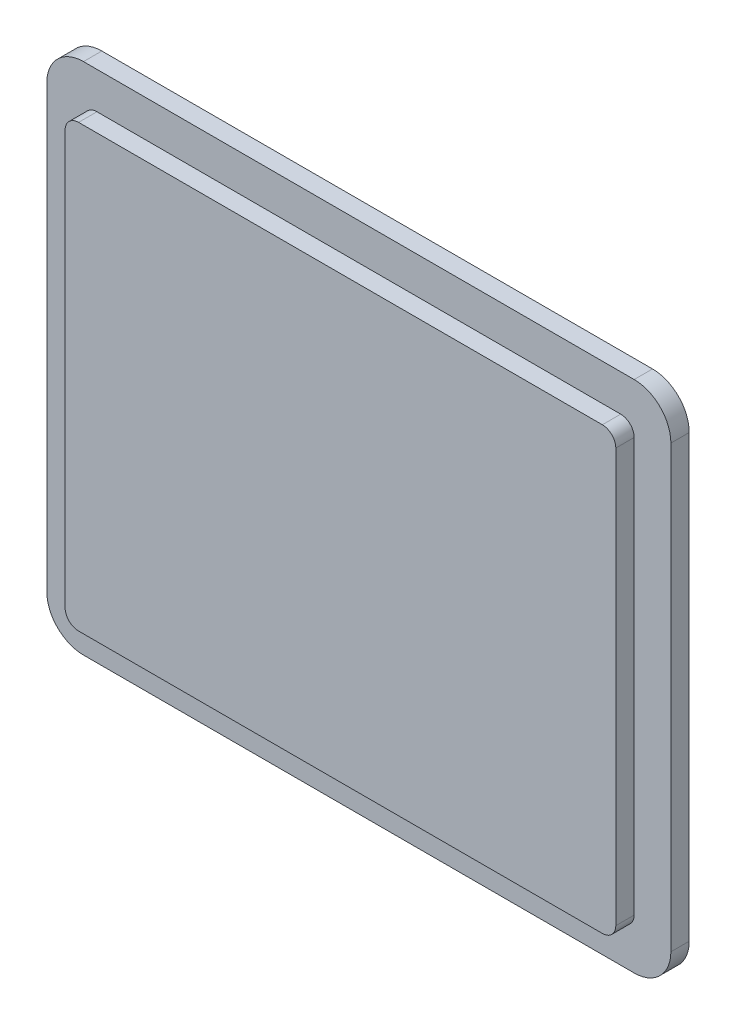
ISO-10303-21;
HEADER;
FILE_DESCRIPTION(('STEP AP214'),'2;1');
FILE_NAME('part.step','',(''),(''),'','','');
FILE_SCHEMA(('AUTOMOTIVE_DESIGN { 1 0 10303 214 1 1 1 1 }'));
ENDSEC;
DATA;
#1=APPLICATION_CONTEXT('core data for automotive mechanical design processes');
#2=APPLICATION_PROTOCOL_DEFINITION('international standard','automotive_design',2000,#1);
#3=PRODUCT_CONTEXT('',#1,'mechanical');
#4=PRODUCT('Part','Part','',(#3));
#5=PRODUCT_RELATED_PRODUCT_CATEGORY('part','',(#4));
#6=PRODUCT_DEFINITION_FORMATION('','',#4);
#7=PRODUCT_DEFINITION_CONTEXT('part definition',#1,'design');
#8=PRODUCT_DEFINITION('design','',#6,#7);
#9=PRODUCT_DEFINITION_SHAPE('','',#8);
#10=(LENGTH_UNIT() NAMED_UNIT(*) SI_UNIT(.MILLI.,.METRE.));
#11=(NAMED_UNIT(*) PLANE_ANGLE_UNIT() SI_UNIT($,.RADIAN.));
#12=(NAMED_UNIT(*) SI_UNIT($,.STERADIAN.) SOLID_ANGLE_UNIT());
#13=UNCERTAINTY_MEASURE_WITH_UNIT(LENGTH_MEASURE(1.E-05),#10,'distance_accuracy_value','');
#14=(GEOMETRIC_REPRESENTATION_CONTEXT(3) GLOBAL_UNCERTAINTY_ASSIGNED_CONTEXT((#13)) GLOBAL_UNIT_ASSIGNED_CONTEXT((#10,
#11,#12)) REPRESENTATION_CONTEXT('',''));
#15=CARTESIAN_POINT('',(0.,0.,0.));
#16=DIRECTION('',(0.,0.,1.));
#17=DIRECTION('',(1.,0.,0.));
#18=AXIS2_PLACEMENT_3D('',#15,#16,#17);
#19=CARTESIAN_POINT('',(48.,3.,3.));
#20=DIRECTION('',(0.,0.,-1.));
#21=DIRECTION('',(-1.,0.,0.));
#22=AXIS2_PLACEMENT_3D('',#19,#20,#21);
#23=CYLINDRICAL_SURFACE('',#22,3.);
#24=CARTESIAN_POINT('',(48.,3.,1.5));
#25=DIRECTION('',(0.,0.,1.));
#26=DIRECTION('',(1.,0.,0.));
#27=AXIS2_PLACEMENT_3D('',#24,#25,#26);
#28=CIRCLE('',#27,3.);
#29=CARTESIAN_POINT('',(48.,0.,1.5));
#30=VERTEX_POINT('',#29);
#31=CARTESIAN_POINT('',(51.,3.,1.5));
#32=VERTEX_POINT('',#31);
#33=EDGE_CURVE('E232',#30,#32,#28,.T.);
#34=ORIENTED_EDGE('',*,*,#33,.F.);
#35=DIRECTION('',(0.,0.,-1.));
#36=VECTOR('',#35,1.);
#37=CARTESIAN_POINT('',(48.,0.,3.));
#38=LINE('',#37,#36);
#39=CARTESIAN_POINT('',(48.,0.,0.));
#40=VERTEX_POINT('',#39);
#41=EDGE_CURVE('E258',#30,#40,#38,.T.);
#42=ORIENTED_EDGE('',*,*,#41,.T.);
#43=CARTESIAN_POINT('',(48.,3.,0.));
#44=DIRECTION('',(0.,0.,1.));
#45=DIRECTION('',(1.,0.,0.));
#46=AXIS2_PLACEMENT_3D('',#43,#44,#45);
#47=CIRCLE('',#46,3.);
#48=CARTESIAN_POINT('',(51.,3.,0.));
#49=VERTEX_POINT('',#48);
#50=EDGE_CURVE('E234',#40,#49,#47,.T.);
#51=ORIENTED_EDGE('',*,*,#50,.T.);
#52=DIRECTION('',(0.,0.,-1.));
#53=VECTOR('',#52,1.);
#54=CARTESIAN_POINT('',(51.,3.,3.));
#55=LINE('',#54,#53);
#56=EDGE_CURVE('E44',#32,#49,#55,.T.);
#57=ORIENTED_EDGE('',*,*,#56,.F.);
#58=EDGE_LOOP('',(#34,#42,#51,#57));
#59=FACE_BOUND('',#58,.T.);
#60=ADVANCED_FACE('F37',(#59),#23,.T.);
#61=CARTESIAN_POINT('',(51.,3.,3.));
#62=DIRECTION('',(-1.,0.,0.));
#63=DIRECTION('',(0.,-1.,0.));
#64=AXIS2_PLACEMENT_3D('',#61,#62,#63);
#65=PLANE('',#64);
#66=DIRECTION('',(0.,1.,0.));
#67=VECTOR('',#66,1.);
#68=CARTESIAN_POINT('',(51.,3.,1.5));
#69=LINE('',#68,#67);
#70=CARTESIAN_POINT('',(51.,39.,1.5));
#71=VERTEX_POINT('',#70);
#72=EDGE_CURVE('E230',#32,#71,#69,.T.);
#73=ORIENTED_EDGE('',*,*,#72,.F.);
#74=ORIENTED_EDGE('',*,*,#56,.T.);
#75=DIRECTION('',(0.,1.,0.));
#76=VECTOR('',#75,1.);
#77=CARTESIAN_POINT('',(51.,3.,0.));
#78=LINE('',#77,#76);
#79=CARTESIAN_POINT('',(51.,39.,0.));
#80=VERTEX_POINT('',#79);
#81=EDGE_CURVE('E237',#49,#80,#78,.T.);
#82=ORIENTED_EDGE('',*,*,#81,.T.);
#83=DIRECTION('',(0.,0.,-1.));
#84=VECTOR('',#83,1.);
#85=CARTESIAN_POINT('',(51.,39.,3.));
#86=LINE('',#85,#84);
#87=EDGE_CURVE('E270',#71,#80,#86,.T.);
#88=ORIENTED_EDGE('',*,*,#87,.F.);
#89=EDGE_LOOP('',(#73,#74,#82,#88));
#90=FACE_BOUND('',#89,.T.);
#91=ADVANCED_FACE('F275',(#90),#65,.F.);
#92=CARTESIAN_POINT('',(48.,39.,3.));
#93=DIRECTION('',(0.,0.,-1.));
#94=DIRECTION('',(-1.,0.,0.));
#95=AXIS2_PLACEMENT_3D('',#92,#93,#94);
#96=CYLINDRICAL_SURFACE('',#95,3.);
#97=CARTESIAN_POINT('',(48.,39.,1.5));
#98=DIRECTION('',(0.,0.,1.));
#99=DIRECTION('',(1.,0.,0.));
#100=AXIS2_PLACEMENT_3D('',#97,#98,#99);
#101=CIRCLE('',#100,3.);
#102=CARTESIAN_POINT('',(48.,42.,1.5));
#103=VERTEX_POINT('',#102);
#104=EDGE_CURVE('E228',#71,#103,#101,.T.);
#105=ORIENTED_EDGE('',*,*,#104,.F.);
#106=ORIENTED_EDGE('',*,*,#87,.T.);
#107=CARTESIAN_POINT('',(48.,39.,0.));
#108=DIRECTION('',(0.,0.,1.));
#109=DIRECTION('',(1.,0.,0.));
#110=AXIS2_PLACEMENT_3D('',#107,#108,#109);
#111=CIRCLE('',#110,3.);
#112=CARTESIAN_POINT('',(48.,42.,0.));
#113=VERTEX_POINT('',#112);
#114=EDGE_CURVE('E240',#80,#113,#111,.T.);
#115=ORIENTED_EDGE('',*,*,#114,.T.);
#116=DIRECTION('',(0.,0.,-1.));
#117=VECTOR('',#116,1.);
#118=CARTESIAN_POINT('',(48.,42.,3.));
#119=LINE('',#118,#117);
#120=EDGE_CURVE('E268',#103,#113,#119,.T.);
#121=ORIENTED_EDGE('',*,*,#120,.F.);
#122=EDGE_LOOP('',(#105,#106,#115,#121));
#123=FACE_BOUND('',#122,.T.);
#124=ADVANCED_FACE('F309',(#123),#96,.T.);
#125=CARTESIAN_POINT('',(3.,42.,3.));
#126=DIRECTION('',(0.,-1.,0.));
#127=DIRECTION('',(1.,0.,0.));
#128=AXIS2_PLACEMENT_3D('',#125,#126,#127);
#129=PLANE('',#128);
#130=DIRECTION('',(-1.,0.,0.));
#131=VECTOR('',#130,1.);
#132=CARTESIAN_POINT('',(3.,42.,1.5));
#133=LINE('',#132,#131);
#134=CARTESIAN_POINT('',(3.,42.,1.5));
#135=VERTEX_POINT('',#134);
#136=EDGE_CURVE('E226',#103,#135,#133,.T.);
#137=ORIENTED_EDGE('',*,*,#136,.F.);
#138=ORIENTED_EDGE('',*,*,#120,.T.);
#139=DIRECTION('',(-1.,0.,0.));
#140=VECTOR('',#139,1.);
#141=CARTESIAN_POINT('',(3.,42.,0.));
#142=LINE('',#141,#140);
#143=CARTESIAN_POINT('',(3.,42.,0.));
#144=VERTEX_POINT('',#143);
#145=EDGE_CURVE('E243',#113,#144,#142,.T.);
#146=ORIENTED_EDGE('',*,*,#145,.T.);
#147=DIRECTION('',(0.,0.,-1.));
#148=VECTOR('',#147,1.);
#149=CARTESIAN_POINT('',(3.,42.,3.));
#150=LINE('',#149,#148);
#151=EDGE_CURVE('E266',#135,#144,#150,.T.);
#152=ORIENTED_EDGE('',*,*,#151,.F.);
#153=EDGE_LOOP('',(#137,#138,#146,#152));
#154=FACE_BOUND('',#153,.T.);
#155=ADVANCED_FACE('F305',(#154),#129,.F.);
#156=CARTESIAN_POINT('',(3.,39.,3.));
#157=DIRECTION('',(0.,0.,-1.));
#158=DIRECTION('',(-1.,0.,0.));
#159=AXIS2_PLACEMENT_3D('',#156,#157,#158);
#160=CYLINDRICAL_SURFACE('',#159,3.);
#161=CARTESIAN_POINT('',(3.,39.,1.5));
#162=DIRECTION('',(0.,0.,1.));
#163=DIRECTION('',(1.,0.,0.));
#164=AXIS2_PLACEMENT_3D('',#161,#162,#163);
#165=CIRCLE('',#164,3.);
#166=CARTESIAN_POINT('',(0.,39.,1.5));
#167=VERTEX_POINT('',#166);
#168=EDGE_CURVE('E224',#135,#167,#165,.T.);
#169=ORIENTED_EDGE('',*,*,#168,.F.);
#170=ORIENTED_EDGE('',*,*,#151,.T.);
#171=CARTESIAN_POINT('',(3.,39.,0.));
#172=DIRECTION('',(0.,0.,1.));
#173=DIRECTION('',(-1.,0.,0.));
#174=AXIS2_PLACEMENT_3D('',#171,#172,#173);
#175=CIRCLE('',#174,3.);
#176=CARTESIAN_POINT('',(0.,39.,0.));
#177=VERTEX_POINT('',#176);
#178=EDGE_CURVE('E246',#144,#177,#175,.T.);
#179=ORIENTED_EDGE('',*,*,#178,.T.);
#180=DIRECTION('',(0.,0.,-1.));
#181=VECTOR('',#180,1.);
#182=CARTESIAN_POINT('',(0.,39.,3.));
#183=LINE('',#182,#181);
#184=EDGE_CURVE('E264',#167,#177,#183,.T.);
#185=ORIENTED_EDGE('',*,*,#184,.F.);
#186=EDGE_LOOP('',(#169,#170,#179,#185));
#187=FACE_BOUND('',#186,.T.);
#188=ADVANCED_FACE('F301',(#187),#160,.T.);
#189=CARTESIAN_POINT('',(0.,3.,3.));
#190=DIRECTION('',(1.,0.,0.));
#191=DIRECTION('',(0.,0.,-1.));
#192=AXIS2_PLACEMENT_3D('',#189,#190,#191);
#193=PLANE('',#192);
#194=DIRECTION('',(0.,-1.,0.));
#195=VECTOR('',#194,1.);
#196=CARTESIAN_POINT('',(0.,3.,1.5));
#197=LINE('',#196,#195);
#198=CARTESIAN_POINT('',(0.,3.,1.5));
#199=VERTEX_POINT('',#198);
#200=EDGE_CURVE('E222',#167,#199,#197,.T.);
#201=ORIENTED_EDGE('',*,*,#200,.F.);
#202=ORIENTED_EDGE('',*,*,#184,.T.);
#203=DIRECTION('',(0.,-1.,0.));
#204=VECTOR('',#203,1.);
#205=CARTESIAN_POINT('',(0.,3.,0.));
#206=LINE('',#205,#204);
#207=CARTESIAN_POINT('',(0.,3.,0.));
#208=VERTEX_POINT('',#207);
#209=EDGE_CURVE('E249',#177,#208,#206,.T.);
#210=ORIENTED_EDGE('',*,*,#209,.T.);
#211=DIRECTION('',(0.,0.,-1.));
#212=VECTOR('',#211,1.);
#213=CARTESIAN_POINT('',(0.,3.,3.));
#214=LINE('',#213,#212);
#215=EDGE_CURVE('E262',#199,#208,#214,.T.);
#216=ORIENTED_EDGE('',*,*,#215,.F.);
#217=EDGE_LOOP('',(#201,#202,#210,#216));
#218=FACE_BOUND('',#217,.T.);
#219=ADVANCED_FACE('F297',(#218),#193,.F.);
#220=CARTESIAN_POINT('',(3.,3.,3.));
#221=DIRECTION('',(0.,0.,-1.));
#222=DIRECTION('',(-1.,0.,0.));
#223=AXIS2_PLACEMENT_3D('',#220,#221,#222);
#224=CYLINDRICAL_SURFACE('',#223,3.);
#225=CARTESIAN_POINT('',(3.,3.,1.5));
#226=DIRECTION('',(0.,0.,1.));
#227=DIRECTION('',(1.,0.,0.));
#228=AXIS2_PLACEMENT_3D('',#225,#226,#227);
#229=CIRCLE('',#228,3.);
#230=CARTESIAN_POINT('',(3.,0.,1.5));
#231=VERTEX_POINT('',#230);
#232=EDGE_CURVE('E50',#199,#231,#229,.T.);
#233=ORIENTED_EDGE('',*,*,#232,.F.);
#234=ORIENTED_EDGE('',*,*,#215,.T.);
#235=CARTESIAN_POINT('',(3.,3.,0.));
#236=DIRECTION('',(0.,0.,1.));
#237=DIRECTION('',(1.,0.,0.));
#238=AXIS2_PLACEMENT_3D('',#235,#236,#237);
#239=CIRCLE('',#238,3.);
#240=CARTESIAN_POINT('',(3.,0.,0.));
#241=VERTEX_POINT('',#240);
#242=EDGE_CURVE('E252',#208,#241,#239,.T.);
#243=ORIENTED_EDGE('',*,*,#242,.T.);
#244=DIRECTION('',(0.,0.,-1.));
#245=VECTOR('',#244,1.);
#246=CARTESIAN_POINT('',(3.,0.,3.));
#247=LINE('',#246,#245);
#248=EDGE_CURVE('E260',#231,#241,#247,.T.);
#249=ORIENTED_EDGE('',*,*,#248,.F.);
#250=EDGE_LOOP('',(#233,#234,#243,#249));
#251=FACE_BOUND('',#250,.T.);
#252=ADVANCED_FACE('F293',(#251),#224,.T.);
#253=CARTESIAN_POINT('',(3.,0.,3.));
#254=DIRECTION('',(0.,1.,0.));
#255=DIRECTION('',(0.,0.,1.));
#256=AXIS2_PLACEMENT_3D('',#253,#254,#255);
#257=PLANE('',#256);
#258=DIRECTION('',(1.,0.,0.));
#259=VECTOR('',#258,1.);
#260=CARTESIAN_POINT('',(3.,0.,1.5));
#261=LINE('',#260,#259);
#262=EDGE_CURVE('E12',#231,#30,#261,.T.);
#263=ORIENTED_EDGE('',*,*,#262,.F.);
#264=ORIENTED_EDGE('',*,*,#248,.T.);
#265=DIRECTION('',(1.,0.,0.));
#266=VECTOR('',#265,1.);
#267=CARTESIAN_POINT('',(3.,0.,0.));
#268=LINE('',#267,#266);
#269=EDGE_CURVE('E255',#241,#40,#268,.T.);
#270=ORIENTED_EDGE('',*,*,#269,.T.);
#271=ORIENTED_EDGE('',*,*,#41,.F.);
#272=EDGE_LOOP('',(#263,#264,#270,#271));
#273=FACE_BOUND('',#272,.T.);
#274=ADVANCED_FACE('F287',(#273),#257,.F.);
#275=CARTESIAN_POINT('',(48.,3.,0.));
#276=DIRECTION('',(0.,0.,1.));
#277=DIRECTION('',(1.,0.,0.));
#278=AXIS2_PLACEMENT_3D('',#275,#276,#277);
#279=PLANE('',#278);
#280=ORIENTED_EDGE('',*,*,#50,.F.);
#281=ORIENTED_EDGE('',*,*,#269,.F.);
#282=ORIENTED_EDGE('',*,*,#242,.F.);
#283=ORIENTED_EDGE('',*,*,#209,.F.);
#284=ORIENTED_EDGE('',*,*,#178,.F.);
#285=ORIENTED_EDGE('',*,*,#145,.F.);
#286=ORIENTED_EDGE('',*,*,#114,.F.);
#287=ORIENTED_EDGE('',*,*,#81,.F.);
#288=EDGE_LOOP('',(#280,#281,#282,#283,#284,#285,#286,#287));
#289=FACE_BOUND('',#288,.T.);
#290=ADVANCED_FACE('F282',(#289),#279,.F.);
#291=CARTESIAN_POINT('',(30.8066217222268,17.1089695866766,1.5));
#292=DIRECTION('',(0.,0.,1.));
#293=DIRECTION('',(1.,0.,0.));
#294=AXIS2_PLACEMENT_3D('',#291,#292,#293);
#295=PLANE('',#294);
#296=DIRECTION('',(0.,1.,0.));
#297=VECTOR('',#296,1.);
#298=CARTESIAN_POINT('',(48.,37.9,1.5));
#299=LINE('',#298,#297);
#300=CARTESIAN_POINT('',(48.,4.1,1.5));
#301=VERTEX_POINT('',#300);
#302=CARTESIAN_POINT('',(48.,37.9,1.5));
#303=VERTEX_POINT('',#302);
#304=EDGE_CURVE('E160',#301,#303,#299,.T.);
#305=ORIENTED_EDGE('',*,*,#304,.F.);
#306=CARTESIAN_POINT('',(46.9,4.10000000000001,1.5));
#307=DIRECTION('',(0.,0.,1.));
#308=DIRECTION('',(-1.,0.,0.));
#309=AXIS2_PLACEMENT_3D('',#306,#307,#308);
#310=CIRCLE('',#309,1.1);
#311=CARTESIAN_POINT('',(46.9,3.00000000000001,1.5));
#312=VERTEX_POINT('',#311);
#313=EDGE_CURVE('E190',#312,#301,#310,.T.);
#314=ORIENTED_EDGE('',*,*,#313,.F.);
#315=DIRECTION('',(1.,0.,0.));
#316=VECTOR('',#315,1.);
#317=CARTESIAN_POINT('',(4.10000000000001,3.,1.5));
#318=LINE('',#317,#316);
#319=CARTESIAN_POINT('',(4.10000000000001,3.00000000000001,1.5));
#320=VERTEX_POINT('',#319);
#321=EDGE_CURVE('E187',#320,#312,#318,.T.);
#322=ORIENTED_EDGE('',*,*,#321,.F.);
#323=CARTESIAN_POINT('',(4.10000000000001,4.10000000000001,1.5));
#324=DIRECTION('',(0.,0.,1.));
#325=DIRECTION('',(1.,0.,0.));
#326=AXIS2_PLACEMENT_3D('',#323,#324,#325);
#327=CIRCLE('',#326,1.1);
#328=CARTESIAN_POINT('',(3.00000000000001,4.09999999999999,1.5));
#329=VERTEX_POINT('',#328);
#330=EDGE_CURVE('E184',#329,#320,#327,.T.);
#331=ORIENTED_EDGE('',*,*,#330,.F.);
#332=DIRECTION('',(0.,-1.,0.));
#333=VECTOR('',#332,1.);
#334=CARTESIAN_POINT('',(3.,37.9,1.5));
#335=LINE('',#334,#333);
#336=CARTESIAN_POINT('',(3.,37.9,1.5));
#337=VERTEX_POINT('',#336);
#338=EDGE_CURVE('E181',#337,#329,#335,.T.);
#339=ORIENTED_EDGE('',*,*,#338,.F.);
#340=CARTESIAN_POINT('',(4.10000000000001,37.9,1.5));
#341=DIRECTION('',(0.,0.,1.));
#342=DIRECTION('',(-1.,0.,0.));
#343=AXIS2_PLACEMENT_3D('',#340,#341,#342);
#344=CIRCLE('',#343,1.1);
#345=CARTESIAN_POINT('',(4.10000000000001,39.,1.5));
#346=VERTEX_POINT('',#345);
#347=EDGE_CURVE('E170',#346,#337,#344,.T.);
#348=ORIENTED_EDGE('',*,*,#347,.F.);
#349=DIRECTION('',(-1.,0.,0.));
#350=VECTOR('',#349,1.);
#351=CARTESIAN_POINT('',(4.10000000000001,39.,1.5));
#352=LINE('',#351,#350);
#353=CARTESIAN_POINT('',(46.9,39.,1.5));
#354=VERTEX_POINT('',#353);
#355=EDGE_CURVE('E152',#354,#346,#352,.T.);
#356=ORIENTED_EDGE('',*,*,#355,.F.);
#357=CARTESIAN_POINT('',(46.9,37.9,1.5));
#358=DIRECTION('',(0.,0.,1.));
#359=DIRECTION('',(-1.,0.,0.));
#360=AXIS2_PLACEMENT_3D('',#357,#358,#359);
#361=CIRCLE('',#360,1.1);
#362=EDGE_CURVE('E166',#303,#354,#361,.T.);
#363=ORIENTED_EDGE('',*,*,#362,.F.);
#364=EDGE_LOOP('',(#305,#314,#322,#331,#339,#348,#356,#363));
#365=FACE_BOUND('',#364,.T.);
#366=ORIENTED_EDGE('',*,*,#33,.T.);
#367=ORIENTED_EDGE('',*,*,#72,.T.);
#368=ORIENTED_EDGE('',*,*,#104,.T.);
#369=ORIENTED_EDGE('',*,*,#136,.T.);
#370=ORIENTED_EDGE('',*,*,#168,.T.);
#371=ORIENTED_EDGE('',*,*,#200,.T.);
#372=ORIENTED_EDGE('',*,*,#232,.T.);
#373=ORIENTED_EDGE('',*,*,#262,.T.);
#374=EDGE_LOOP('',(#366,#367,#368,#369,#370,#371,#372,#373));
#375=FACE_BOUND('',#374,.T.);
#376=ADVANCED_FACE('F165',(#365,#375),#295,.T.);
#377=CARTESIAN_POINT('',(46.9,37.9,1.5));
#378=DIRECTION('',(0.,0.,1.));
#379=DIRECTION('',(1.,0.,0.));
#380=AXIS2_PLACEMENT_3D('',#377,#378,#379);
#381=CYLINDRICAL_SURFACE('',#380,1.1);
#382=CARTESIAN_POINT('',(46.9,37.9,3.));
#383=DIRECTION('',(0.,0.,1.));
#384=DIRECTION('',(-1.,0.,0.));
#385=AXIS2_PLACEMENT_3D('',#382,#383,#384);
#386=CIRCLE('',#385,1.1);
#387=CARTESIAN_POINT('',(48.,37.9,3.));
#388=VERTEX_POINT('',#387);
#389=CARTESIAN_POINT('',(46.9,39.,3.));
#390=VERTEX_POINT('',#389);
#391=EDGE_CURVE('E194',#388,#390,#386,.T.);
#392=ORIENTED_EDGE('',*,*,#391,.F.);
#393=DIRECTION('',(0.,0.,1.));
#394=VECTOR('',#393,1.);
#395=CARTESIAN_POINT('',(48.,37.9,1.5));
#396=LINE('',#395,#394);
#397=EDGE_CURVE('E173',#303,#388,#396,.T.);
#398=ORIENTED_EDGE('',*,*,#397,.F.);
#399=ORIENTED_EDGE('',*,*,#362,.T.);
#400=DIRECTION('',(0.,0.,1.));
#401=VECTOR('',#400,1.);
#402=CARTESIAN_POINT('',(46.9,39.,1.5));
#403=LINE('',#402,#401);
#404=EDGE_CURVE('E149',#354,#390,#403,.T.);
#405=ORIENTED_EDGE('',*,*,#404,.T.);
#406=EDGE_LOOP('',(#392,#398,#399,#405));
#407=FACE_BOUND('',#406,.T.);
#408=ADVANCED_FACE('F172',(#407),#381,.T.);
#409=CARTESIAN_POINT('',(48.,37.9,1.5));
#410=DIRECTION('',(1.,0.,0.));
#411=DIRECTION('',(0.,0.,-1.));
#412=AXIS2_PLACEMENT_3D('',#409,#410,#411);
#413=PLANE('',#412);
#414=DIRECTION('',(0.,1.,0.));
#415=VECTOR('',#414,1.);
#416=CARTESIAN_POINT('',(48.,37.9,3.));
#417=LINE('',#416,#415);
#418=CARTESIAN_POINT('',(48.,4.1,3.));
#419=VERTEX_POINT('',#418);
#420=EDGE_CURVE('E174',#419,#388,#417,.T.);
#421=ORIENTED_EDGE('',*,*,#420,.F.);
#422=DIRECTION('',(0.,0.,1.));
#423=VECTOR('',#422,1.);
#424=CARTESIAN_POINT('',(48.,4.1,1.5));
#425=LINE('',#424,#423);
#426=EDGE_CURVE('E210',#301,#419,#425,.T.);
#427=ORIENTED_EDGE('',*,*,#426,.F.);
#428=ORIENTED_EDGE('',*,*,#304,.T.);
#429=ORIENTED_EDGE('',*,*,#397,.T.);
#430=EDGE_LOOP('',(#421,#427,#428,#429));
#431=FACE_BOUND('',#430,.T.);
#432=ADVANCED_FACE('F316',(#431),#413,.T.);
#433=CARTESIAN_POINT('',(46.9,4.10000000000001,1.5));
#434=DIRECTION('',(0.,0.,1.));
#435=DIRECTION('',(1.,0.,0.));
#436=AXIS2_PLACEMENT_3D('',#433,#434,#435);
#437=CYLINDRICAL_SURFACE('',#436,1.1);
#438=CARTESIAN_POINT('',(46.9,4.10000000000001,3.));
#439=DIRECTION('',(0.,0.,1.));
#440=DIRECTION('',(-1.,0.,0.));
#441=AXIS2_PLACEMENT_3D('',#438,#439,#440);
#442=CIRCLE('',#441,1.1);
#443=CARTESIAN_POINT('',(46.9,3.00000000000001,3.));
#444=VERTEX_POINT('',#443);
#445=EDGE_CURVE('E177',#444,#419,#442,.T.);
#446=ORIENTED_EDGE('',*,*,#445,.F.);
#447=DIRECTION('',(0.,0.,1.));
#448=VECTOR('',#447,1.);
#449=CARTESIAN_POINT('',(46.9,3.00000000000001,1.5));
#450=LINE('',#449,#448);
#451=EDGE_CURVE('E212',#312,#444,#450,.T.);
#452=ORIENTED_EDGE('',*,*,#451,.F.);
#453=ORIENTED_EDGE('',*,*,#313,.T.);
#454=ORIENTED_EDGE('',*,*,#426,.T.);
#455=EDGE_LOOP('',(#446,#452,#453,#454));
#456=FACE_BOUND('',#455,.T.);
#457=ADVANCED_FACE('F352',(#456),#437,.T.);
#458=CARTESIAN_POINT('',(4.10000000000001,3.,1.5));
#459=DIRECTION('',(0.,-1.,0.));
#460=DIRECTION('',(1.,0.,0.));
#461=AXIS2_PLACEMENT_3D('',#458,#459,#460);
#462=PLANE('',#461);
#463=DIRECTION('',(1.,0.,0.));
#464=VECTOR('',#463,1.);
#465=CARTESIAN_POINT('',(4.10000000000001,3.,3.));
#466=LINE('',#465,#464);
#467=CARTESIAN_POINT('',(4.10000000000001,3.00000000000001,3.));
#468=VERTEX_POINT('',#467);
#469=EDGE_CURVE('E204',#468,#444,#466,.T.);
#470=ORIENTED_EDGE('',*,*,#469,.F.);
#471=DIRECTION('',(0.,0.,1.));
#472=VECTOR('',#471,1.);
#473=CARTESIAN_POINT('',(4.10000000000001,3.00000000000001,1.5));
#474=LINE('',#473,#472);
#475=EDGE_CURVE('E214',#320,#468,#474,.T.);
#476=ORIENTED_EDGE('',*,*,#475,.F.);
#477=ORIENTED_EDGE('',*,*,#321,.T.);
#478=ORIENTED_EDGE('',*,*,#451,.T.);
#479=EDGE_LOOP('',(#470,#476,#477,#478));
#480=FACE_BOUND('',#479,.T.);
#481=ADVANCED_FACE('F355',(#480),#462,.T.);
#482=CARTESIAN_POINT('',(4.10000000000001,4.10000000000001,1.5));
#483=DIRECTION('',(0.,0.,1.));
#484=DIRECTION('',(1.,0.,0.));
#485=AXIS2_PLACEMENT_3D('',#482,#483,#484);
#486=CYLINDRICAL_SURFACE('',#485,1.1);
#487=CARTESIAN_POINT('',(4.10000000000001,4.10000000000001,3.));
#488=DIRECTION('',(0.,0.,1.));
#489=DIRECTION('',(1.,0.,0.));
#490=AXIS2_PLACEMENT_3D('',#487,#488,#489);
#491=CIRCLE('',#490,1.1);
#492=CARTESIAN_POINT('',(3.00000000000001,4.09999999999999,3.));
#493=VERTEX_POINT('',#492);
#494=EDGE_CURVE('E201',#493,#468,#491,.T.);
#495=ORIENTED_EDGE('',*,*,#494,.F.);
#496=DIRECTION('',(0.,0.,1.));
#497=VECTOR('',#496,1.);
#498=CARTESIAN_POINT('',(3.00000000000001,4.09999999999999,1.5));
#499=LINE('',#498,#497);
#500=EDGE_CURVE('E216',#329,#493,#499,.T.);
#501=ORIENTED_EDGE('',*,*,#500,.F.);
#502=ORIENTED_EDGE('',*,*,#330,.T.);
#503=ORIENTED_EDGE('',*,*,#475,.T.);
#504=EDGE_LOOP('',(#495,#501,#502,#503));
#505=FACE_BOUND('',#504,.T.);
#506=ADVANCED_FACE('F359',(#505),#486,.T.);
#507=CARTESIAN_POINT('',(3.,37.9,1.5));
#508=DIRECTION('',(-1.,0.,0.));
#509=DIRECTION('',(0.,-1.,0.));
#510=AXIS2_PLACEMENT_3D('',#507,#508,#509);
#511=PLANE('',#510);
#512=DIRECTION('',(0.,-1.,0.));
#513=VECTOR('',#512,1.);
#514=CARTESIAN_POINT('',(3.,37.9,3.));
#515=LINE('',#514,#513);
#516=CARTESIAN_POINT('',(3.,37.9,3.));
#517=VERTEX_POINT('',#516);
#518=EDGE_CURVE('E198',#517,#493,#515,.T.);
#519=ORIENTED_EDGE('',*,*,#518,.F.);
#520=DIRECTION('',(0.,0.,1.));
#521=VECTOR('',#520,1.);
#522=CARTESIAN_POINT('',(3.,37.9,1.5));
#523=LINE('',#522,#521);
#524=EDGE_CURVE('E218',#337,#517,#523,.T.);
#525=ORIENTED_EDGE('',*,*,#524,.F.);
#526=ORIENTED_EDGE('',*,*,#338,.T.);
#527=ORIENTED_EDGE('',*,*,#500,.T.);
#528=EDGE_LOOP('',(#519,#525,#526,#527));
#529=FACE_BOUND('',#528,.T.);
#530=ADVANCED_FACE('F362',(#529),#511,.T.);
#531=CARTESIAN_POINT('',(4.10000000000001,37.9,1.5));
#532=DIRECTION('',(0.,0.,1.));
#533=DIRECTION('',(1.,0.,0.));
#534=AXIS2_PLACEMENT_3D('',#531,#532,#533);
#535=CYLINDRICAL_SURFACE('',#534,1.1);
#536=CARTESIAN_POINT('',(4.10000000000001,37.9,3.));
#537=DIRECTION('',(0.,0.,1.));
#538=DIRECTION('',(-1.,0.,0.));
#539=AXIS2_PLACEMENT_3D('',#536,#537,#538);
#540=CIRCLE('',#539,1.1);
#541=CARTESIAN_POINT('',(4.10000000000001,39.,3.));
#542=VERTEX_POINT('',#541);
#543=EDGE_CURVE('E58',#542,#517,#540,.T.);
#544=ORIENTED_EDGE('',*,*,#543,.F.);
#545=DIRECTION('',(0.,0.,1.));
#546=VECTOR('',#545,1.);
#547=CARTESIAN_POINT('',(4.10000000000001,39.,1.5));
#548=LINE('',#547,#546);
#549=EDGE_CURVE('E159',#346,#542,#548,.T.);
#550=ORIENTED_EDGE('',*,*,#549,.F.);
#551=ORIENTED_EDGE('',*,*,#347,.T.);
#552=ORIENTED_EDGE('',*,*,#524,.T.);
#553=EDGE_LOOP('',(#544,#550,#551,#552));
#554=FACE_BOUND('',#553,.T.);
#555=ADVANCED_FACE('F344',(#554),#535,.T.);
#556=CARTESIAN_POINT('',(4.10000000000001,39.,1.5));
#557=DIRECTION('',(0.,1.,0.));
#558=DIRECTION('',(-1.,0.,0.));
#559=AXIS2_PLACEMENT_3D('',#556,#557,#558);
#560=PLANE('',#559);
#561=DIRECTION('',(-1.,0.,0.));
#562=VECTOR('',#561,1.);
#563=CARTESIAN_POINT('',(4.10000000000001,39.,3.));
#564=LINE('',#563,#562);
#565=EDGE_CURVE('E154',#390,#542,#564,.T.);
#566=ORIENTED_EDGE('',*,*,#565,.F.);
#567=ORIENTED_EDGE('',*,*,#404,.F.);
#568=ORIENTED_EDGE('',*,*,#355,.T.);
#569=ORIENTED_EDGE('',*,*,#549,.T.);
#570=EDGE_LOOP('',(#566,#567,#568,#569));
#571=FACE_BOUND('',#570,.T.);
#572=ADVANCED_FACE('F151',(#571),#560,.T.);
#573=CARTESIAN_POINT('',(48.,3.,3.));
#574=DIRECTION('',(0.,0.,1.));
#575=DIRECTION('',(1.,0.,0.));
#576=AXIS2_PLACEMENT_3D('',#573,#574,#575);
#577=PLANE('',#576);
#578=ORIENTED_EDGE('',*,*,#420,.T.);
#579=ORIENTED_EDGE('',*,*,#391,.T.);
#580=ORIENTED_EDGE('',*,*,#565,.T.);
#581=ORIENTED_EDGE('',*,*,#543,.T.);
#582=ORIENTED_EDGE('',*,*,#518,.T.);
#583=ORIENTED_EDGE('',*,*,#494,.T.);
#584=ORIENTED_EDGE('',*,*,#469,.T.);
#585=ORIENTED_EDGE('',*,*,#445,.T.);
#586=EDGE_LOOP('',(#578,#579,#580,#581,#582,#583,#584,#585));
#587=FACE_BOUND('',#586,.T.);
#588=ADVANCED_FACE('F338',(#587),#577,.T.);
#589=CLOSED_SHELL('',(#60,#91,#124,#155,#188,#219,#252,#274,#290,#376,#408,#432,#457,#481,#506,
#530,#555,#572,#588));
#590=MANIFOLD_SOLID_BREP('B2',#589);
#591=ADVANCED_BREP_SHAPE_REPRESENTATION('',(#18,#590),#14);
#592=SHAPE_DEFINITION_REPRESENTATION(#9,#591);
ENDSEC;
END-ISO-10303-21;
